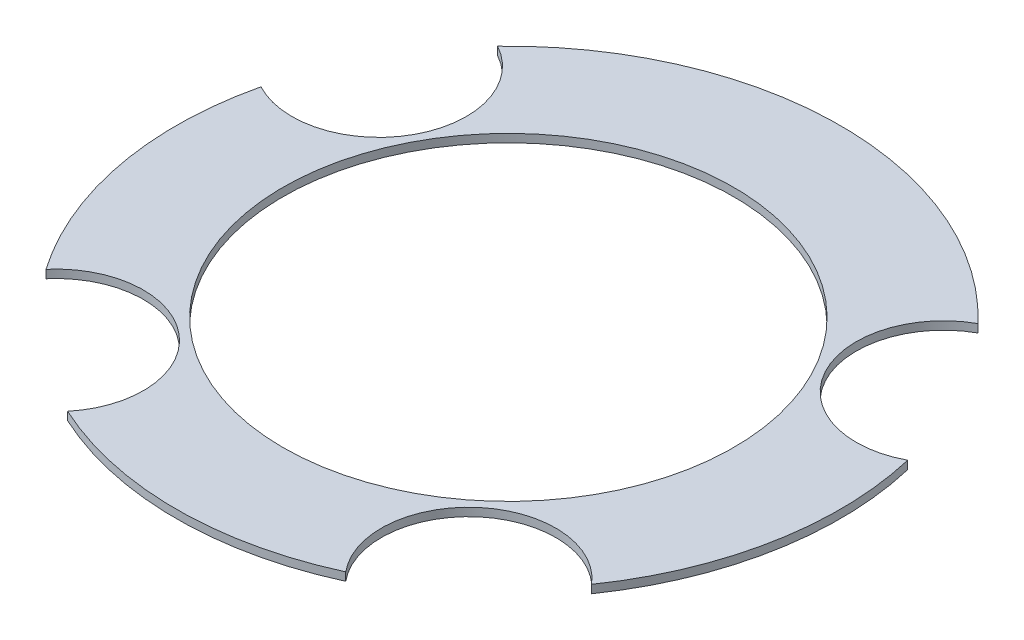
ISO-10303-21;
HEADER;
FILE_DESCRIPTION(('STEP AP214'),'2;1');
FILE_NAME('part.step','',(''),(''),'','','');
FILE_SCHEMA(('AUTOMOTIVE_DESIGN { 1 0 10303 214 1 1 1 1 }'));
ENDSEC;
DATA;
#1=APPLICATION_CONTEXT('core data for automotive mechanical design processes');
#2=APPLICATION_PROTOCOL_DEFINITION('international standard','automotive_design',2000,#1);
#3=PRODUCT_CONTEXT('',#1,'mechanical');
#4=PRODUCT('Part','Part','',(#3));
#5=PRODUCT_RELATED_PRODUCT_CATEGORY('part','',(#4));
#6=PRODUCT_DEFINITION_FORMATION('','',#4);
#7=PRODUCT_DEFINITION_CONTEXT('part definition',#1,'design');
#8=PRODUCT_DEFINITION('design','',#6,#7);
#9=PRODUCT_DEFINITION_SHAPE('','',#8);
#10=(LENGTH_UNIT() NAMED_UNIT(*) SI_UNIT(.MILLI.,.METRE.));
#11=(NAMED_UNIT(*) PLANE_ANGLE_UNIT() SI_UNIT($,.RADIAN.));
#12=(NAMED_UNIT(*) SI_UNIT($,.STERADIAN.) SOLID_ANGLE_UNIT());
#13=UNCERTAINTY_MEASURE_WITH_UNIT(LENGTH_MEASURE(1.E-05),#10,'distance_accuracy_value','');
#14=(GEOMETRIC_REPRESENTATION_CONTEXT(3) GLOBAL_UNCERTAINTY_ASSIGNED_CONTEXT((#13)) GLOBAL_UNIT_ASSIGNED_CONTEXT((#10,
#11,#12)) REPRESENTATION_CONTEXT('',''));
#15=CARTESIAN_POINT('',(0.,0.,0.));
#16=DIRECTION('',(0.,0.,1.));
#17=DIRECTION('',(1.,0.,0.));
#18=AXIS2_PLACEMENT_3D('',#15,#16,#17);
#19=CARTESIAN_POINT('',(29.391570254063,1.,2.611368153912));
#20=DIRECTION('',(0.,-1.,0.));
#21=DIRECTION('',(0.,0.,-1.));
#22=AXIS2_PLACEMENT_3D('',#19,#20,#21);
#23=CYLINDRICAL_SURFACE('',#22,40.538);
#24=CARTESIAN_POINT('',(29.391570254063,0.,2.611368153912));
#25=DIRECTION('',(0.,1.,0.));
#26=DIRECTION('',(0.,0.,1.));
#27=AXIS2_PLACEMENT_3D('',#24,#25,#26);
#28=CIRCLE('',#27,40.538);
#29=CARTESIAN_POINT('',(58.7036621935782,0.,-25.3909658582629));
#30=VERTEX_POINT('',#29);
#31=CARTESIAN_POINT('',(0.0794783145477923,0.,-25.3909658582629));
#32=VERTEX_POINT('',#31);
#33=EDGE_CURVE('E106',#30,#32,#28,.T.);
#34=ORIENTED_EDGE('',*,*,#33,.T.);
#35=DIRECTION('',(0.,-1.,0.));
#36=VECTOR('',#35,1.);
#37=CARTESIAN_POINT('',(0.0794783145477923,0.5,-25.3909658582629));
#38=LINE('',#37,#36);
#39=CARTESIAN_POINT('',(0.0794783145477923,1.,-25.3909658582629));
#40=VERTEX_POINT('',#39);
#41=EDGE_CURVE('E11',#32,#40,#38,.F.);
#42=ORIENTED_EDGE('',*,*,#41,.T.);
#43=CARTESIAN_POINT('',(29.391570254063,1.,2.611368153912));
#44=DIRECTION('',(0.,1.,0.));
#45=DIRECTION('',(0.,0.,1.));
#46=AXIS2_PLACEMENT_3D('',#43,#44,#45);
#47=CIRCLE('',#46,40.538);
#48=CARTESIAN_POINT('',(58.7036621935782,1.,-25.3909658582629));
#49=VERTEX_POINT('',#48);
#50=EDGE_CURVE('E146',#49,#40,#47,.T.);
#51=ORIENTED_EDGE('',*,*,#50,.F.);
#52=DIRECTION('',(0.,-1.,0.));
#53=VECTOR('',#52,1.);
#54=CARTESIAN_POINT('',(58.7036621935782,0.5,-25.3909658582629));
#55=LINE('',#54,#53);
#56=EDGE_CURVE('E110',#49,#30,#55,.T.);
#57=ORIENTED_EDGE('',*,*,#56,.T.);
#58=EDGE_LOOP('',(#34,#42,#51,#57));
#59=FACE_BOUND('',#58,.T.);
#60=ADVANCED_FACE('F32',(#59),#23,.T.);
#61=CARTESIAN_POINT('',(62.6829840070901,0.,25.7416775838518));
#62=VERTEX_POINT('',#61);
#63=CARTESIAN_POINT('',(68.853863498798,0.,-6.66531529797628));
#64=VERTEX_POINT('',#63);
#65=EDGE_CURVE('E111',#62,#64,#28,.T.);
#66=ORIENTED_EDGE('',*,*,#65,.T.);
#67=DIRECTION('',(0.,-1.,0.));
#68=VECTOR('',#67,1.);
#69=CARTESIAN_POINT('',(68.853863498798,0.5,-6.66531529797628));
#70=LINE('',#69,#68);
#71=CARTESIAN_POINT('',(68.853863498798,1.,-6.66531529797628));
#72=VERTEX_POINT('',#71);
#73=EDGE_CURVE('E135',#64,#72,#70,.F.);
#74=ORIENTED_EDGE('',*,*,#73,.T.);
#75=CARTESIAN_POINT('',(62.6829840070901,1.,25.7416775838518));
#76=VERTEX_POINT('',#75);
#77=EDGE_CURVE('E198',#76,#72,#47,.T.);
#78=ORIENTED_EDGE('',*,*,#77,.F.);
#79=DIRECTION('',(0.,-1.,0.));
#80=VECTOR('',#79,1.);
#81=CARTESIAN_POINT('',(62.6829840070901,0.5,25.7416775838518));
#82=LINE('',#81,#80);
#83=EDGE_CURVE('E128',#76,#62,#82,.T.);
#84=ORIENTED_EDGE('',*,*,#83,.T.);
#85=EDGE_LOOP('',(#66,#74,#78,#84));
#86=FACE_BOUND('',#85,.T.);
#87=ADVANCED_FACE('F181',(#86),#23,.T.);
#88=CARTESIAN_POINT('',(12.421916418591,0.,39.426586375515));
#89=VERTEX_POINT('',#88);
#90=CARTESIAN_POINT('',(46.361224089535,0.,39.426586375515));
#91=VERTEX_POINT('',#90);
#92=EDGE_CURVE('E114',#89,#91,#28,.T.);
#93=ORIENTED_EDGE('',*,*,#92,.T.);
#94=DIRECTION('',(0.,-1.,0.));
#95=VECTOR('',#94,1.);
#96=CARTESIAN_POINT('',(46.361224089535,0.5,39.426586375515));
#97=LINE('',#96,#95);
#98=CARTESIAN_POINT('',(46.361224089535,1.,39.426586375515));
#99=VERTEX_POINT('',#98);
#100=EDGE_CURVE('E131',#91,#99,#97,.F.);
#101=ORIENTED_EDGE('',*,*,#100,.T.);
#102=CARTESIAN_POINT('',(12.421916418591,1.,39.426586375515));
#103=VERTEX_POINT('',#102);
#104=EDGE_CURVE('E120',#103,#99,#47,.T.);
#105=ORIENTED_EDGE('',*,*,#104,.F.);
#106=DIRECTION('',(0.,-1.,0.));
#107=VECTOR('',#106,1.);
#108=CARTESIAN_POINT('',(12.421916418591,0.5,39.426586375515));
#109=LINE('',#108,#107);
#110=EDGE_CURVE('E122',#103,#89,#109,.T.);
#111=ORIENTED_EDGE('',*,*,#110,.T.);
#112=EDGE_LOOP('',(#93,#101,#105,#111));
#113=FACE_BOUND('',#112,.T.);
#114=ADVANCED_FACE('F178',(#113),#23,.T.);
#115=CARTESIAN_POINT('',(29.391570254063,1.,2.611368153912));
#116=DIRECTION('',(0.,1.,0.));
#117=DIRECTION('',(0.,0.,1.));
#118=AXIS2_PLACEMENT_3D('',#115,#116,#117);
#119=PLANE('',#118);
#120=CARTESIAN_POINT('',(-5.04655351727874,1.,-16.0557477215989));
#121=DIRECTION('',(0.,-1.,0.));
#122=DIRECTION('',(0.,0.,-1.));
#123=AXIS2_PLACEMENT_3D('',#120,#121,#122);
#124=CIRCLE('',#123,10.65);
#125=CARTESIAN_POINT('',(-10.0707229906721,1.,-6.66531529797628));
#126=VERTEX_POINT('',#125);
#127=EDGE_CURVE('E96',#40,#126,#124,.T.);
#128=ORIENTED_EDGE('',*,*,#127,.T.);
#129=CARTESIAN_POINT('',(-3.89984349896406,1.,25.7416775838518));
#130=VERTEX_POINT('',#129);
#131=EDGE_CURVE('E119',#126,#130,#47,.T.);
#132=ORIENTED_EDGE('',*,*,#131,.T.);
#133=CARTESIAN_POINT('',(4.22381540092492,1.,32.6285249088804));
#134=DIRECTION('',(0.,-1.,0.));
#135=DIRECTION('',(0.,0.,-1.));
#136=AXIS2_PLACEMENT_3D('',#133,#134,#135);
#137=CIRCLE('',#136,10.65);
#138=EDGE_CURVE('E158',#130,#103,#137,.T.);
#139=ORIENTED_EDGE('',*,*,#138,.T.);
#140=ORIENTED_EDGE('',*,*,#104,.T.);
#141=CARTESIAN_POINT('',(54.5593251072011,1.,32.6285249088804));
#142=DIRECTION('',(0.,-1.,0.));
#143=DIRECTION('',(0.,0.,-1.));
#144=AXIS2_PLACEMENT_3D('',#141,#142,#143);
#145=CIRCLE('',#144,10.65);
#146=EDGE_CURVE('E153',#99,#76,#145,.T.);
#147=ORIENTED_EDGE('',*,*,#146,.T.);
#148=ORIENTED_EDGE('',*,*,#77,.T.);
#149=CARTESIAN_POINT('',(63.8296940254047,1.,-16.0557477215989));
#150=DIRECTION('',(0.,-1.,0.));
#151=DIRECTION('',(0.,0.,-1.));
#152=AXIS2_PLACEMENT_3D('',#149,#150,#151);
#153=CIRCLE('',#152,10.65);
#154=EDGE_CURVE('E148',#72,#49,#153,.T.);
#155=ORIENTED_EDGE('',*,*,#154,.T.);
#156=ORIENTED_EDGE('',*,*,#50,.T.);
#157=EDGE_LOOP('',(#128,#132,#139,#140,#147,#148,#155,#156));
#158=FACE_BOUND('',#157,.T.);
#159=CARTESIAN_POINT('',(29.391570254063,1.,2.611368153912));
#160=DIRECTION('',(0.,1.,0.));
#161=DIRECTION('',(0.,0.,1.));
#162=AXIS2_PLACEMENT_3D('',#159,#160,#161);
#163=CIRCLE('',#162,27.506);
#164=CARTESIAN_POINT('',(29.391570254063,1.,30.117368153912));
#165=VERTEX_POINT('',#164);
#166=EDGE_CURVE('E115',#165,#165,#163,.T.);
#167=ORIENTED_EDGE('',*,*,#166,.F.);
#168=EDGE_LOOP('',(#167));
#169=FACE_BOUND('',#168,.T.);
#170=ADVANCED_FACE('F141',(#158,#169),#119,.T.);
#171=CARTESIAN_POINT('',(29.391570254063,0.,2.611368153912));
#172=DIRECTION('',(0.,1.,0.));
#173=DIRECTION('',(0.,0.,1.));
#174=AXIS2_PLACEMENT_3D('',#171,#172,#173);
#175=PLANE('',#174);
#176=CARTESIAN_POINT('',(-10.0707229906721,0.,-6.66531529797628));
#177=VERTEX_POINT('',#176);
#178=CARTESIAN_POINT('',(-3.89984349896406,0.,25.7416775838518));
#179=VERTEX_POINT('',#178);
#180=EDGE_CURVE('E108',#177,#179,#28,.T.);
#181=ORIENTED_EDGE('',*,*,#180,.F.);
#182=CARTESIAN_POINT('',(-5.04655351727874,0.,-16.0557477215989));
#183=DIRECTION('',(0.,-1.,0.));
#184=DIRECTION('',(0.,0.,-1.));
#185=AXIS2_PLACEMENT_3D('',#182,#183,#184);
#186=CIRCLE('',#185,10.65);
#187=EDGE_CURVE('E47',#32,#177,#186,.T.);
#188=ORIENTED_EDGE('',*,*,#187,.F.);
#189=ORIENTED_EDGE('',*,*,#33,.F.);
#190=CARTESIAN_POINT('',(63.8296940254047,0.,-16.0557477215989));
#191=DIRECTION('',(0.,-1.,0.));
#192=DIRECTION('',(0.,0.,-1.));
#193=AXIS2_PLACEMENT_3D('',#190,#191,#192);
#194=CIRCLE('',#193,10.65);
#195=EDGE_CURVE('E55',#64,#30,#194,.T.);
#196=ORIENTED_EDGE('',*,*,#195,.F.);
#197=ORIENTED_EDGE('',*,*,#65,.F.);
#198=CARTESIAN_POINT('',(54.5593251072011,0.,32.6285249088804));
#199=DIRECTION('',(0.,-1.,0.));
#200=DIRECTION('',(0.,0.,-1.));
#201=AXIS2_PLACEMENT_3D('',#198,#199,#200);
#202=CIRCLE('',#201,10.65);
#203=EDGE_CURVE('E151',#91,#62,#202,.T.);
#204=ORIENTED_EDGE('',*,*,#203,.F.);
#205=ORIENTED_EDGE('',*,*,#92,.F.);
#206=CARTESIAN_POINT('',(4.22381540092492,0.,32.6285249088804));
#207=DIRECTION('',(0.,-1.,0.));
#208=DIRECTION('',(0.,0.,-1.));
#209=AXIS2_PLACEMENT_3D('',#206,#207,#208);
#210=CIRCLE('',#209,10.65);
#211=EDGE_CURVE('E156',#179,#89,#210,.T.);
#212=ORIENTED_EDGE('',*,*,#211,.F.);
#213=EDGE_LOOP('',(#181,#188,#189,#196,#197,#204,#205,#212));
#214=FACE_BOUND('',#213,.T.);
#215=CARTESIAN_POINT('',(29.391570254063,0.,2.611368153912));
#216=DIRECTION('',(0.,1.,0.));
#217=DIRECTION('',(0.,0.,1.));
#218=AXIS2_PLACEMENT_3D('',#215,#216,#217);
#219=CIRCLE('',#218,27.506);
#220=CARTESIAN_POINT('',(29.391570254063,0.,30.117368153912));
#221=VERTEX_POINT('',#220);
#222=EDGE_CURVE('E160',#221,#221,#219,.T.);
#223=ORIENTED_EDGE('',*,*,#222,.T.);
#224=EDGE_LOOP('',(#223));
#225=FACE_BOUND('',#224,.T.);
#226=ADVANCED_FACE('F104',(#214,#225),#175,.F.);
#227=ORIENTED_EDGE('',*,*,#131,.F.);
#228=DIRECTION('',(0.,-1.,0.));
#229=VECTOR('',#228,1.);
#230=CARTESIAN_POINT('',(-10.0707229906721,0.5,-6.66531529797628));
#231=LINE('',#230,#229);
#232=EDGE_CURVE('E40',#126,#177,#231,.T.);
#233=ORIENTED_EDGE('',*,*,#232,.T.);
#234=ORIENTED_EDGE('',*,*,#180,.T.);
#235=DIRECTION('',(0.,-1.,0.));
#236=VECTOR('',#235,1.);
#237=CARTESIAN_POINT('',(-3.89984349896406,0.5,25.7416775838518));
#238=LINE('',#237,#236);
#239=EDGE_CURVE('E125',#179,#130,#238,.F.);
#240=ORIENTED_EDGE('',*,*,#239,.T.);
#241=EDGE_LOOP('',(#227,#233,#234,#240));
#242=FACE_BOUND('',#241,.T.);
#243=ADVANCED_FACE('F34',(#242),#23,.T.);
#244=CARTESIAN_POINT('',(29.391570254063,1.,2.611368153912));
#245=DIRECTION('',(0.,-1.,0.));
#246=DIRECTION('',(0.,0.,-1.));
#247=AXIS2_PLACEMENT_3D('',#244,#245,#246);
#248=CYLINDRICAL_SURFACE('',#247,27.506);
#249=ORIENTED_EDGE('',*,*,#166,.T.);
#250=EDGE_LOOP('',(#249));
#251=FACE_BOUND('',#250,.T.);
#252=ORIENTED_EDGE('',*,*,#222,.F.);
#253=EDGE_LOOP('',(#252));
#254=FACE_BOUND('',#253,.T.);
#255=ADVANCED_FACE('F166',(#251,#254),#248,.F.);
#256=CARTESIAN_POINT('',(4.22381540092492,1.,32.6285249088804));
#257=DIRECTION('',(0.,-1.,0.));
#258=DIRECTION('',(0.,0.,-1.));
#259=AXIS2_PLACEMENT_3D('',#256,#257,#258);
#260=CYLINDRICAL_SURFACE('',#259,10.65);
#261=ORIENTED_EDGE('',*,*,#211,.T.);
#262=ORIENTED_EDGE('',*,*,#110,.F.);
#263=ORIENTED_EDGE('',*,*,#138,.F.);
#264=ORIENTED_EDGE('',*,*,#239,.F.);
#265=EDGE_LOOP('',(#261,#262,#263,#264));
#266=FACE_BOUND('',#265,.T.);
#267=ADVANCED_FACE('F168',(#266),#260,.F.);
#268=CARTESIAN_POINT('',(54.5593251072011,1.,32.6285249088804));
#269=DIRECTION('',(0.,-1.,0.));
#270=DIRECTION('',(0.,0.,-1.));
#271=AXIS2_PLACEMENT_3D('',#268,#269,#270);
#272=CYLINDRICAL_SURFACE('',#271,10.65);
#273=ORIENTED_EDGE('',*,*,#203,.T.);
#274=ORIENTED_EDGE('',*,*,#83,.F.);
#275=ORIENTED_EDGE('',*,*,#146,.F.);
#276=ORIENTED_EDGE('',*,*,#100,.F.);
#277=EDGE_LOOP('',(#273,#274,#275,#276));
#278=FACE_BOUND('',#277,.T.);
#279=ADVANCED_FACE('F175',(#278),#272,.F.);
#280=CARTESIAN_POINT('',(63.8296940254047,1.,-16.0557477215989));
#281=DIRECTION('',(0.,-1.,0.));
#282=DIRECTION('',(0.,0.,-1.));
#283=AXIS2_PLACEMENT_3D('',#280,#281,#282);
#284=CYLINDRICAL_SURFACE('',#283,10.65);
#285=ORIENTED_EDGE('',*,*,#195,.T.);
#286=ORIENTED_EDGE('',*,*,#56,.F.);
#287=ORIENTED_EDGE('',*,*,#154,.F.);
#288=ORIENTED_EDGE('',*,*,#73,.F.);
#289=EDGE_LOOP('',(#285,#286,#287,#288));
#290=FACE_BOUND('',#289,.T.);
#291=ADVANCED_FACE('F199',(#290),#284,.F.);
#292=CARTESIAN_POINT('',(-5.04655351727874,1.,-16.0557477215989));
#293=DIRECTION('',(0.,-1.,0.));
#294=DIRECTION('',(0.,0.,-1.));
#295=AXIS2_PLACEMENT_3D('',#292,#293,#294);
#296=CYLINDRICAL_SURFACE('',#295,10.65);
#297=ORIENTED_EDGE('',*,*,#187,.T.);
#298=ORIENTED_EDGE('',*,*,#232,.F.);
#299=ORIENTED_EDGE('',*,*,#127,.F.);
#300=ORIENTED_EDGE('',*,*,#41,.F.);
#301=EDGE_LOOP('',(#297,#298,#299,#300));
#302=FACE_BOUND('',#301,.T.);
#303=ADVANCED_FACE('F94',(#302),#296,.F.);
#304=CLOSED_SHELL('',(#60,#87,#114,#170,#226,#243,#255,#267,#279,#291,#303));
#305=MANIFOLD_SOLID_BREP('B2',#304);
#306=ADVANCED_BREP_SHAPE_REPRESENTATION('',(#18,#305),#14);
#307=SHAPE_DEFINITION_REPRESENTATION(#9,#306);
ENDSEC;
END-ISO-10303-21;
